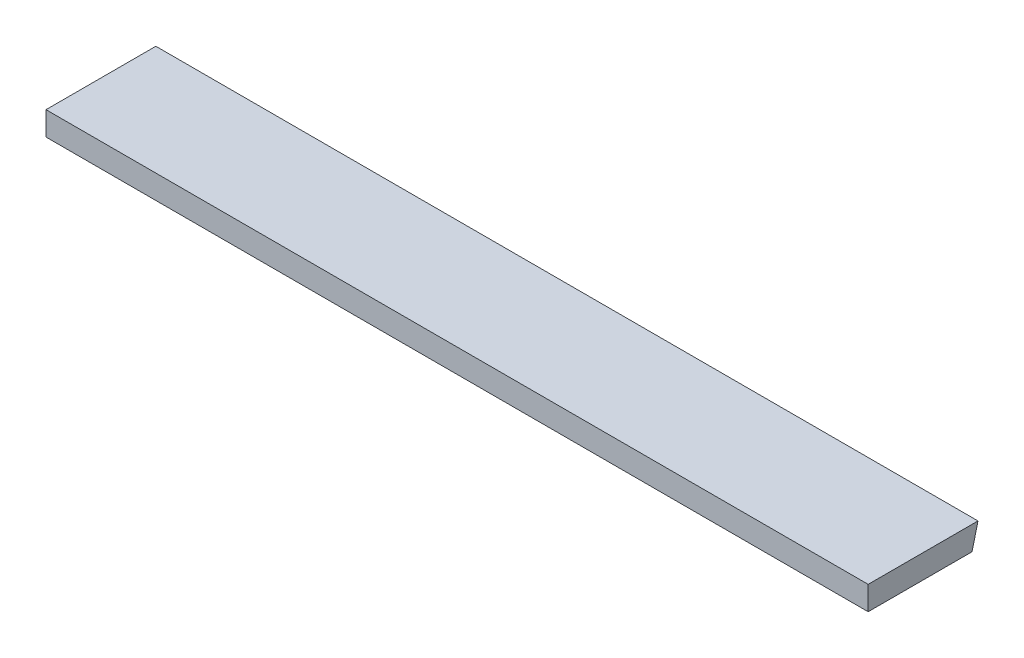
ISO-10303-21;
HEADER;
FILE_DESCRIPTION(('STEP AP214'),'2;1');
FILE_NAME('part.step','',(''),(''),'','','');
FILE_SCHEMA(('AUTOMOTIVE_DESIGN { 1 0 10303 214 1 1 1 1 }'));
ENDSEC;
DATA;
#1=APPLICATION_CONTEXT('core data for automotive mechanical design processes');
#2=APPLICATION_PROTOCOL_DEFINITION('international standard','automotive_design',2000,#1);
#3=PRODUCT_CONTEXT('',#1,'mechanical');
#4=PRODUCT('Part','Part','',(#3));
#5=PRODUCT_RELATED_PRODUCT_CATEGORY('part','',(#4));
#6=PRODUCT_DEFINITION_FORMATION('','',#4);
#7=PRODUCT_DEFINITION_CONTEXT('part definition',#1,'design');
#8=PRODUCT_DEFINITION('design','',#6,#7);
#9=PRODUCT_DEFINITION_SHAPE('','',#8);
#10=(LENGTH_UNIT() NAMED_UNIT(*) SI_UNIT(.MILLI.,.METRE.));
#11=(NAMED_UNIT(*) PLANE_ANGLE_UNIT() SI_UNIT($,.RADIAN.));
#12=(NAMED_UNIT(*) SI_UNIT($,.STERADIAN.) SOLID_ANGLE_UNIT());
#13=UNCERTAINTY_MEASURE_WITH_UNIT(LENGTH_MEASURE(1.E-05),#10,'distance_accuracy_value','');
#14=(GEOMETRIC_REPRESENTATION_CONTEXT(3) GLOBAL_UNCERTAINTY_ASSIGNED_CONTEXT((#13)) GLOBAL_UNIT_ASSIGNED_CONTEXT((#10,
#11,#12)) REPRESENTATION_CONTEXT('',''));
#15=CARTESIAN_POINT('',(0.,0.,0.));
#16=DIRECTION('',(0.,0.,1.));
#17=DIRECTION('',(1.,0.,0.));
#18=AXIS2_PLACEMENT_3D('',#15,#16,#17);
#19=CARTESIAN_POINT('',(-93.2729530739432,8.,-5.19128662181619));
#20=DIRECTION('',(1.,0.,0.));
#21=DIRECTION('',(0.,0.,-1.));
#22=AXIS2_PLACEMENT_3D('',#19,#20,#21);
#23=PLANE('',#22);
#24=DIRECTION('',(0.,0.,1.));
#25=VECTOR('',#24,1.);
#26=CARTESIAN_POINT('',(-93.2729530739432,0.,-5.19128662181619));
#27=LINE('',#26,#25);
#28=CARTESIAN_POINT('',(-93.2729530739432,0.,-40.1912866218162));
#29=VERTEX_POINT('',#28);
#30=CARTESIAN_POINT('',(-93.2729530739432,0.,-5.19128662181619));
#31=VERTEX_POINT('',#30);
#32=EDGE_CURVE('E79',#29,#31,#27,.T.);
#33=ORIENTED_EDGE('',*,*,#32,.T.);
#34=DIRECTION('',(0.,-1.,0.));
#35=VECTOR('',#34,1.);
#36=CARTESIAN_POINT('',(-93.2729530739432,8.,-5.19128662181619));
#37=LINE('',#36,#35);
#38=CARTESIAN_POINT('',(-93.2729530739432,8.,-5.19128662181619));
#39=VERTEX_POINT('',#38);
#40=EDGE_CURVE('E11',#39,#31,#37,.T.);
#41=ORIENTED_EDGE('',*,*,#40,.F.);
#42=DIRECTION('',(0.,0.,1.));
#43=VECTOR('',#42,1.);
#44=CARTESIAN_POINT('',(-93.2729530739432,8.,-5.19128662181619));
#45=LINE('',#44,#43);
#46=CARTESIAN_POINT('',(-93.2729530739432,8.,-42.1962952424629));
#47=VERTEX_POINT('',#46);
#48=EDGE_CURVE('E101',#47,#39,#45,.T.);
#49=ORIENTED_EDGE('',*,*,#48,.F.);
#50=DIRECTION('',(0.,-0.969999438852852,0.243107154615311));
#51=VECTOR('',#50,1.);
#52=CARTESIAN_POINT('',(-93.2729530739432,0.,-40.1912866218162));
#53=LINE('',#52,#51);
#54=EDGE_CURVE('E97',#47,#29,#53,.T.);
#55=ORIENTED_EDGE('',*,*,#54,.T.);
#56=EDGE_LOOP('',(#33,#41,#49,#55));
#57=FACE_BOUND('',#56,.T.);
#58=ADVANCED_FACE('F45',(#57),#23,.F.);
#59=CARTESIAN_POINT('',(-93.2729530739432,8.,-5.19128662181619));
#60=DIRECTION('',(0.,0.,-1.));
#61=DIRECTION('',(-1.,0.,0.));
#62=AXIS2_PLACEMENT_3D('',#59,#60,#61);
#63=PLANE('',#62);
#64=DIRECTION('',(1.,0.,0.));
#65=VECTOR('',#64,1.);
#66=CARTESIAN_POINT('',(-93.2729530739432,0.,-5.19128662181619));
#67=LINE('',#66,#65);
#68=CARTESIAN_POINT('',(183.727046926057,0.,-5.19128662181619));
#69=VERTEX_POINT('',#68);
#70=EDGE_CURVE('E73',#31,#69,#67,.T.);
#71=ORIENTED_EDGE('',*,*,#70,.T.);
#72=DIRECTION('',(0.,-1.,0.));
#73=VECTOR('',#72,1.);
#74=CARTESIAN_POINT('',(183.727046926057,8.,-5.19128662181619));
#75=LINE('',#74,#73);
#76=CARTESIAN_POINT('',(183.727046926057,8.,-5.19128662181619));
#77=VERTEX_POINT('',#76);
#78=EDGE_CURVE('E54',#77,#69,#75,.T.);
#79=ORIENTED_EDGE('',*,*,#78,.F.);
#80=DIRECTION('',(1.,0.,0.));
#81=VECTOR('',#80,1.);
#82=CARTESIAN_POINT('',(-93.2729530739432,8.,-5.19128662181619));
#83=LINE('',#82,#81);
#84=EDGE_CURVE('E62',#39,#77,#83,.T.);
#85=ORIENTED_EDGE('',*,*,#84,.F.);
#86=ORIENTED_EDGE('',*,*,#40,.T.);
#87=EDGE_LOOP('',(#71,#79,#85,#86));
#88=FACE_BOUND('',#87,.T.);
#89=ADVANCED_FACE('F127',(#88),#63,.F.);
#90=CARTESIAN_POINT('',(183.727046926057,8.,-40.1912866218162));
#91=DIRECTION('',(-1.,0.,0.));
#92=DIRECTION('',(0.,0.,1.));
#93=AXIS2_PLACEMENT_3D('',#90,#91,#92);
#94=PLANE('',#93);
#95=DIRECTION('',(0.,0.,-1.));
#96=VECTOR('',#95,1.);
#97=CARTESIAN_POINT('',(183.727046926057,0.,-40.1912866218162));
#98=LINE('',#97,#96);
#99=CARTESIAN_POINT('',(183.727046926057,0.,-40.1912866218162));
#100=VERTEX_POINT('',#99);
#101=EDGE_CURVE('E102',#69,#100,#98,.T.);
#102=ORIENTED_EDGE('',*,*,#101,.T.);
#103=DIRECTION('',(0.,-0.969999438852852,0.243107154615311));
#104=VECTOR('',#103,1.);
#105=CARTESIAN_POINT('',(183.727046926057,0.,-40.1912866218162));
#106=LINE('',#105,#104);
#107=CARTESIAN_POINT('',(183.727046926057,8.,-42.1962952424629));
#108=VERTEX_POINT('',#107);
#109=EDGE_CURVE('E99',#108,#100,#106,.T.);
#110=ORIENTED_EDGE('',*,*,#109,.F.);
#111=DIRECTION('',(0.,0.,-1.));
#112=VECTOR('',#111,1.);
#113=CARTESIAN_POINT('',(183.727046926057,8.,-40.1912866218162));
#114=LINE('',#113,#112);
#115=EDGE_CURVE('E117',#77,#108,#114,.T.);
#116=ORIENTED_EDGE('',*,*,#115,.F.);
#117=ORIENTED_EDGE('',*,*,#78,.T.);
#118=EDGE_LOOP('',(#102,#110,#116,#117));
#119=FACE_BOUND('',#118,.T.);
#120=ADVANCED_FACE('F126',(#119),#94,.F.);
#121=CARTESIAN_POINT('',(0.,8.,0.));
#122=DIRECTION('',(0.,-1.,0.));
#123=DIRECTION('',(0.,0.,-1.));
#124=AXIS2_PLACEMENT_3D('',#121,#122,#123);
#125=PLANE('',#124);
#126=ORIENTED_EDGE('',*,*,#48,.T.);
#127=ORIENTED_EDGE('',*,*,#84,.T.);
#128=ORIENTED_EDGE('',*,*,#115,.T.);
#129=DIRECTION('',(-1.,0.,0.));
#130=VECTOR('',#129,1.);
#131=CARTESIAN_POINT('',(183.727046926057,8.,-42.1962952424629));
#132=LINE('',#131,#130);
#133=EDGE_CURVE('E89',#108,#47,#132,.T.);
#134=ORIENTED_EDGE('',*,*,#133,.T.);
#135=EDGE_LOOP('',(#126,#127,#128,#134));
#136=FACE_BOUND('',#135,.T.);
#137=ADVANCED_FACE('F128',(#136),#125,.F.);
#138=CARTESIAN_POINT('',(0.,0.,0.));
#139=DIRECTION('',(0.,-1.,0.));
#140=DIRECTION('',(0.,0.,-1.));
#141=AXIS2_PLACEMENT_3D('',#138,#139,#140);
#142=PLANE('',#141);
#143=ORIENTED_EDGE('',*,*,#32,.F.);
#144=DIRECTION('',(-1.,0.,0.));
#145=VECTOR('',#144,1.);
#146=CARTESIAN_POINT('',(-93.2729530739432,0.,-40.1912866218162));
#147=LINE('',#146,#145);
#148=EDGE_CURVE('E83',#100,#29,#147,.T.);
#149=ORIENTED_EDGE('',*,*,#148,.F.);
#150=ORIENTED_EDGE('',*,*,#101,.F.);
#151=ORIENTED_EDGE('',*,*,#70,.F.);
#152=EDGE_LOOP('',(#143,#149,#150,#151));
#153=FACE_BOUND('',#152,.T.);
#154=ADVANCED_FACE('F81',(#153),#142,.T.);
#155=CARTESIAN_POINT('',(183.727046926057,0.,-40.1912866218162));
#156=DIRECTION('',(0.,-0.243107154615311,-0.969999438852852));
#157=DIRECTION('',(0.,0.969999438852852,-0.243107154615311));
#158=AXIS2_PLACEMENT_3D('',#155,#156,#157);
#159=PLANE('',#158);
#160=ORIENTED_EDGE('',*,*,#54,.F.);
#161=ORIENTED_EDGE('',*,*,#133,.F.);
#162=ORIENTED_EDGE('',*,*,#109,.T.);
#163=ORIENTED_EDGE('',*,*,#148,.T.);
#164=EDGE_LOOP('',(#160,#161,#162,#163));
#165=FACE_BOUND('',#164,.T.);
#166=ADVANCED_FACE('F94',(#165),#159,.T.);
#167=CLOSED_SHELL('',(#58,#89,#120,#137,#154,#166));
#168=MANIFOLD_SOLID_BREP('B2',#167);
#169=ADVANCED_BREP_SHAPE_REPRESENTATION('',(#18,#168),#14);
#170=SHAPE_DEFINITION_REPRESENTATION(#9,#169);
ENDSEC;
END-ISO-10303-21;
